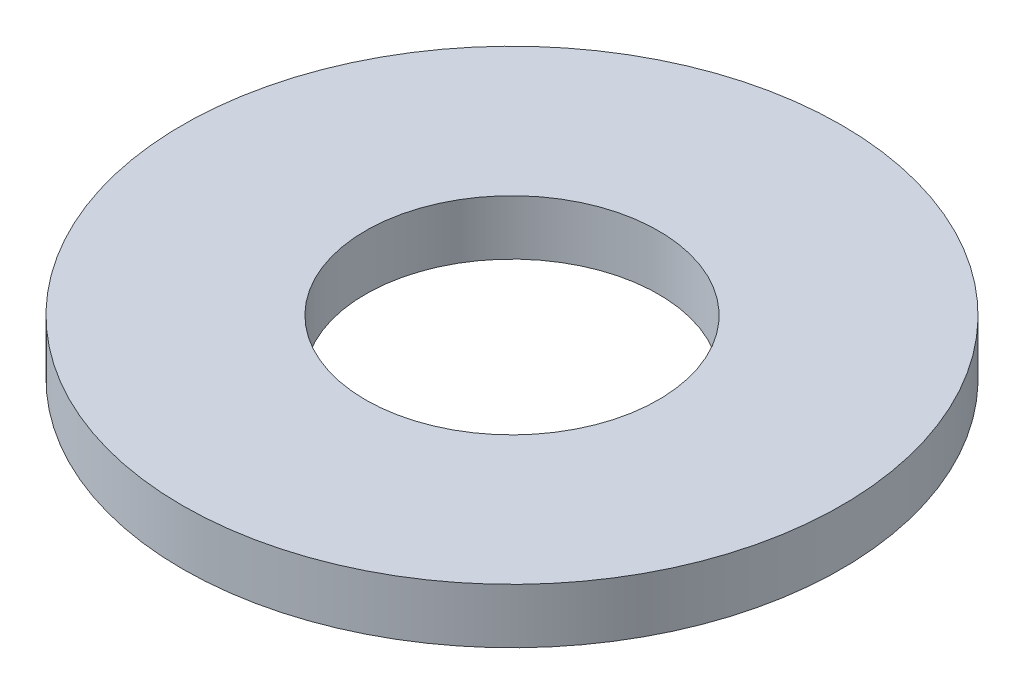
ISO-10303-21;
HEADER;
FILE_DESCRIPTION(('STEP AP214'),'2;1');
FILE_NAME('part.step','',(''),(''),'','','');
FILE_SCHEMA(('AUTOMOTIVE_DESIGN { 1 0 10303 214 1 1 1 1 }'));
ENDSEC;
DATA;
#1=APPLICATION_CONTEXT('core data for automotive mechanical design processes');
#2=APPLICATION_PROTOCOL_DEFINITION('international standard','automotive_design',2000,#1);
#3=PRODUCT_CONTEXT('',#1,'mechanical');
#4=PRODUCT('Part','Part','',(#3));
#5=PRODUCT_RELATED_PRODUCT_CATEGORY('part','',(#4));
#6=PRODUCT_DEFINITION_FORMATION('','',#4);
#7=PRODUCT_DEFINITION_CONTEXT('part definition',#1,'design');
#8=PRODUCT_DEFINITION('design','',#6,#7);
#9=PRODUCT_DEFINITION_SHAPE('','',#8);
#10=(LENGTH_UNIT() NAMED_UNIT(*) SI_UNIT(.MILLI.,.METRE.));
#11=(NAMED_UNIT(*) PLANE_ANGLE_UNIT() SI_UNIT($,.RADIAN.));
#12=(NAMED_UNIT(*) SI_UNIT($,.STERADIAN.) SOLID_ANGLE_UNIT());
#13=UNCERTAINTY_MEASURE_WITH_UNIT(LENGTH_MEASURE(1.E-05),#10,'distance_accuracy_value','');
#14=(GEOMETRIC_REPRESENTATION_CONTEXT(3) GLOBAL_UNCERTAINTY_ASSIGNED_CONTEXT((#13)) GLOBAL_UNIT_ASSIGNED_CONTEXT((#10,
#11,#12)) REPRESENTATION_CONTEXT('',''));
#15=CARTESIAN_POINT('',(0.,0.,0.));
#16=DIRECTION('',(0.,0.,1.));
#17=DIRECTION('',(1.,0.,0.));
#18=AXIS2_PLACEMENT_3D('',#15,#16,#17);
#19=CARTESIAN_POINT('',(0.,1.5,0.));
#20=DIRECTION('',(0.,1.,0.));
#21=DIRECTION('',(0.,0.,1.));
#22=AXIS2_PLACEMENT_3D('',#19,#20,#21);
#23=PLANE('',#22);
#24=CARTESIAN_POINT('',(0.,1.5,0.));
#25=DIRECTION('',(0.,1.,0.));
#26=DIRECTION('',(0.,0.,1.));
#27=AXIS2_PLACEMENT_3D('',#24,#25,#26);
#28=CIRCLE('',#27,9.);
#29=CARTESIAN_POINT('',(0.,1.5,9.));
#30=VERTEX_POINT('',#29);
#31=EDGE_CURVE('E10',#30,#30,#28,.T.);
#32=ORIENTED_EDGE('',*,*,#31,.T.);
#33=EDGE_LOOP('',(#32));
#34=FACE_BOUND('',#33,.T.);
#35=CARTESIAN_POINT('',(0.,1.5,0.));
#36=DIRECTION('',(0.,1.,0.));
#37=DIRECTION('',(0.,0.,1.));
#38=AXIS2_PLACEMENT_3D('',#35,#36,#37);
#39=CIRCLE('',#38,4.);
#40=CARTESIAN_POINT('',(0.,1.5,4.));
#41=VERTEX_POINT('',#40);
#42=EDGE_CURVE('E50',#41,#41,#39,.T.);
#43=ORIENTED_EDGE('',*,*,#42,.F.);
#44=EDGE_LOOP('',(#43));
#45=FACE_BOUND('',#44,.T.);
#46=ADVANCED_FACE('F37',(#34,#45),#23,.T.);
#47=CARTESIAN_POINT('',(0.,0.,0.));
#48=DIRECTION('',(0.,1.,0.));
#49=DIRECTION('',(0.,0.,1.));
#50=AXIS2_PLACEMENT_3D('',#47,#48,#49);
#51=PLANE('',#50);
#52=CARTESIAN_POINT('',(0.,0.,0.));
#53=DIRECTION('',(0.,1.,0.));
#54=DIRECTION('',(0.,0.,1.));
#55=AXIS2_PLACEMENT_3D('',#52,#53,#54);
#56=CIRCLE('',#55,9.);
#57=CARTESIAN_POINT('',(0.,0.,9.));
#58=VERTEX_POINT('',#57);
#59=EDGE_CURVE('E41',#58,#58,#56,.T.);
#60=ORIENTED_EDGE('',*,*,#59,.F.);
#61=EDGE_LOOP('',(#60));
#62=FACE_BOUND('',#61,.T.);
#63=CARTESIAN_POINT('',(0.,0.,0.));
#64=DIRECTION('',(0.,1.,0.));
#65=DIRECTION('',(0.,0.,1.));
#66=AXIS2_PLACEMENT_3D('',#63,#64,#65);
#67=CIRCLE('',#66,4.);
#68=CARTESIAN_POINT('',(0.,0.,4.));
#69=VERTEX_POINT('',#68);
#70=EDGE_CURVE('E52',#69,#69,#67,.T.);
#71=ORIENTED_EDGE('',*,*,#70,.T.);
#72=EDGE_LOOP('',(#71));
#73=FACE_BOUND('',#72,.T.);
#74=ADVANCED_FACE('F64',(#62,#73),#51,.F.);
#75=CARTESIAN_POINT('',(0.,1.5,0.));
#76=DIRECTION('',(0.,-1.,0.));
#77=DIRECTION('',(0.,0.,-1.));
#78=AXIS2_PLACEMENT_3D('',#75,#76,#77);
#79=CYLINDRICAL_SURFACE('',#78,9.);
#80=ORIENTED_EDGE('',*,*,#31,.F.);
#81=EDGE_LOOP('',(#80));
#82=FACE_BOUND('',#81,.T.);
#83=ORIENTED_EDGE('',*,*,#59,.T.);
#84=EDGE_LOOP('',(#83));
#85=FACE_BOUND('',#84,.T.);
#86=ADVANCED_FACE('F39',(#82,#85),#79,.T.);
#87=CARTESIAN_POINT('',(0.,1.5,0.));
#88=DIRECTION('',(0.,-1.,0.));
#89=DIRECTION('',(0.,0.,-1.));
#90=AXIS2_PLACEMENT_3D('',#87,#88,#89);
#91=CYLINDRICAL_SURFACE('',#90,4.);
#92=ORIENTED_EDGE('',*,*,#42,.T.);
#93=EDGE_LOOP('',(#92));
#94=FACE_BOUND('',#93,.T.);
#95=ORIENTED_EDGE('',*,*,#70,.F.);
#96=EDGE_LOOP('',(#95));
#97=FACE_BOUND('',#96,.T.);
#98=ADVANCED_FACE('F60',(#94,#97),#91,.F.);
#99=CLOSED_SHELL('',(#46,#74,#86,#98));
#100=MANIFOLD_SOLID_BREP('B2',#99);
#101=ADVANCED_BREP_SHAPE_REPRESENTATION('',(#18,#100),#14);
#102=SHAPE_DEFINITION_REPRESENTATION(#9,#101);
ENDSEC;
END-ISO-10303-21;
